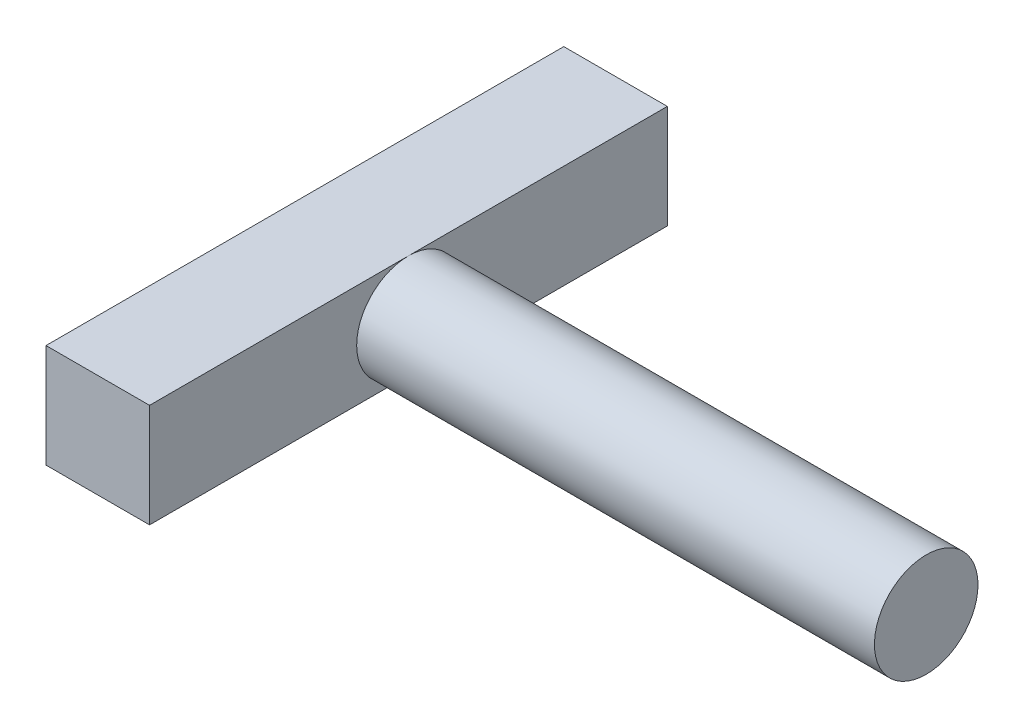
ISO-10303-21;
HEADER;
FILE_DESCRIPTION(('STEP AP214'),'2;1');
FILE_NAME('part.step','',(''),(''),'','','');
FILE_SCHEMA(('AUTOMOTIVE_DESIGN { 1 0 10303 214 1 1 1 1 }'));
ENDSEC;
DATA;
#1=APPLICATION_CONTEXT('core data for automotive mechanical design processes');
#2=APPLICATION_PROTOCOL_DEFINITION('international standard','automotive_design',2000,#1);
#3=PRODUCT_CONTEXT('',#1,'mechanical');
#4=PRODUCT('Part','Part','',(#3));
#5=PRODUCT_RELATED_PRODUCT_CATEGORY('part','',(#4));
#6=PRODUCT_DEFINITION_FORMATION('','',#4);
#7=PRODUCT_DEFINITION_CONTEXT('part definition',#1,'design');
#8=PRODUCT_DEFINITION('design','',#6,#7);
#9=PRODUCT_DEFINITION_SHAPE('','',#8);
#10=(LENGTH_UNIT() NAMED_UNIT(*) SI_UNIT(.MILLI.,.METRE.));
#11=(NAMED_UNIT(*) PLANE_ANGLE_UNIT() SI_UNIT($,.RADIAN.));
#12=(NAMED_UNIT(*) SI_UNIT($,.STERADIAN.) SOLID_ANGLE_UNIT());
#13=UNCERTAINTY_MEASURE_WITH_UNIT(LENGTH_MEASURE(1.E-05),#10,'distance_accuracy_value','');
#14=(GEOMETRIC_REPRESENTATION_CONTEXT(3) GLOBAL_UNCERTAINTY_ASSIGNED_CONTEXT((#13)) GLOBAL_UNIT_ASSIGNED_CONTEXT((#10,
#11,#12)) REPRESENTATION_CONTEXT('',''));
#15=CARTESIAN_POINT('',(0.,0.,0.));
#16=DIRECTION('',(0.,0.,1.));
#17=DIRECTION('',(1.,0.,0.));
#18=AXIS2_PLACEMENT_3D('',#15,#16,#17);
#19=CARTESIAN_POINT('',(12.7,12.7,127.));
#20=DIRECTION('',(-1.,0.,0.));
#21=DIRECTION('',(0.,0.,1.));
#22=AXIS2_PLACEMENT_3D('',#19,#20,#21);
#23=PLANE('',#22);
#24=CARTESIAN_POINT('',(12.7,0.,63.5));
#25=DIRECTION('',(1.,0.,0.));
#26=DIRECTION('',(0.,0.,-1.));
#27=AXIS2_PLACEMENT_3D('',#24,#25,#26);
#28=CIRCLE('',#27,12.7);
#29=CARTESIAN_POINT('',(12.7,12.7,63.5));
#30=VERTEX_POINT('',#29);
#31=CARTESIAN_POINT('',(12.7,-12.7,63.5));
#32=VERTEX_POINT('',#31);
#33=EDGE_CURVE('E56',#30,#32,#28,.T.);
#34=ORIENTED_EDGE('',*,*,#33,.F.);
#35=DIRECTION('',(0.,0.,-1.));
#36=VECTOR('',#35,1.);
#37=CARTESIAN_POINT('',(12.7,12.7,127.));
#38=LINE('',#37,#36);
#39=CARTESIAN_POINT('',(12.7,12.7,127.));
#40=VERTEX_POINT('',#39);
#41=EDGE_CURVE('E49',#40,#30,#38,.T.);
#42=ORIENTED_EDGE('',*,*,#41,.F.);
#43=DIRECTION('',(0.,1.,0.));
#44=VECTOR('',#43,1.);
#45=CARTESIAN_POINT('',(12.7,12.7,127.));
#46=LINE('',#45,#44);
#47=CARTESIAN_POINT('',(12.7,-12.7,127.));
#48=VERTEX_POINT('',#47);
#49=EDGE_CURVE('E153',#48,#40,#46,.T.);
#50=ORIENTED_EDGE('',*,*,#49,.F.);
#51=DIRECTION('',(0.,0.,-1.));
#52=VECTOR('',#51,1.);
#53=CARTESIAN_POINT('',(12.7,-12.7,127.));
#54=LINE('',#53,#52);
#55=EDGE_CURVE('E112',#48,#32,#54,.T.);
#56=ORIENTED_EDGE('',*,*,#55,.T.);
#57=EDGE_LOOP('',(#34,#42,#50,#56));
#58=FACE_BOUND('',#57,.T.);
#59=ADVANCED_FACE('F45',(#58),#23,.F.);
#60=EDGE_CURVE('E11',#32,#30,#28,.T.);
#61=ORIENTED_EDGE('',*,*,#60,.F.);
#62=CARTESIAN_POINT('',(12.7,-12.7,0.));
#63=VERTEX_POINT('',#62);
#64=EDGE_CURVE('E88',#32,#63,#54,.T.);
#65=ORIENTED_EDGE('',*,*,#64,.T.);
#66=DIRECTION('',(0.,1.,0.));
#67=VECTOR('',#66,1.);
#68=CARTESIAN_POINT('',(12.7,12.7,0.));
#69=LINE('',#68,#67);
#70=CARTESIAN_POINT('',(12.7,12.7,0.));
#71=VERTEX_POINT('',#70);
#72=EDGE_CURVE('E107',#63,#71,#69,.T.);
#73=ORIENTED_EDGE('',*,*,#72,.T.);
#74=EDGE_CURVE('E100',#30,#71,#38,.T.);
#75=ORIENTED_EDGE('',*,*,#74,.F.);
#76=EDGE_LOOP('',(#61,#65,#73,#75));
#77=FACE_BOUND('',#76,.T.);
#78=ADVANCED_FACE('F47',(#77),#23,.F.);
#79=CARTESIAN_POINT('',(-12.7,12.7,127.));
#80=DIRECTION('',(0.,-1.,0.));
#81=DIRECTION('',(0.,0.,-1.));
#82=AXIS2_PLACEMENT_3D('',#79,#80,#81);
#83=PLANE('',#82);
#84=DIRECTION('',(-1.,0.,0.));
#85=VECTOR('',#84,1.);
#86=CARTESIAN_POINT('',(-12.7,12.7,0.));
#87=LINE('',#86,#85);
#88=CARTESIAN_POINT('',(-12.7,12.7,0.));
#89=VERTEX_POINT('',#88);
#90=EDGE_CURVE('E171',#71,#89,#87,.T.);
#91=ORIENTED_EDGE('',*,*,#90,.T.);
#92=DIRECTION('',(0.,0.,-1.));
#93=VECTOR('',#92,1.);
#94=CARTESIAN_POINT('',(-12.7,12.7,127.));
#95=LINE('',#94,#93);
#96=CARTESIAN_POINT('',(-12.7,12.7,127.));
#97=VERTEX_POINT('',#96);
#98=EDGE_CURVE('E109',#97,#89,#95,.T.);
#99=ORIENTED_EDGE('',*,*,#98,.F.);
#100=DIRECTION('',(-1.,0.,0.));
#101=VECTOR('',#100,1.);
#102=CARTESIAN_POINT('',(-12.7,12.7,127.));
#103=LINE('',#102,#101);
#104=EDGE_CURVE('E96',#40,#97,#103,.T.);
#105=ORIENTED_EDGE('',*,*,#104,.F.);
#106=ORIENTED_EDGE('',*,*,#41,.T.);
#107=ORIENTED_EDGE('',*,*,#74,.T.);
#108=EDGE_LOOP('',(#91,#99,#105,#106,#107));
#109=FACE_BOUND('',#108,.T.);
#110=ADVANCED_FACE('F99',(#109),#83,.F.);
#111=CARTESIAN_POINT('',(-12.7,12.7,127.));
#112=DIRECTION('',(1.,0.,0.));
#113=DIRECTION('',(0.,0.,-1.));
#114=AXIS2_PLACEMENT_3D('',#111,#112,#113);
#115=PLANE('',#114);
#116=DIRECTION('',(0.,-1.,0.));
#117=VECTOR('',#116,1.);
#118=CARTESIAN_POINT('',(-12.7,12.7,0.));
#119=LINE('',#118,#117);
#120=CARTESIAN_POINT('',(-12.7,-12.7,0.));
#121=VERTEX_POINT('',#120);
#122=EDGE_CURVE('E161',#89,#121,#119,.T.);
#123=ORIENTED_EDGE('',*,*,#122,.T.);
#124=DIRECTION('',(0.,0.,-1.));
#125=VECTOR('',#124,1.);
#126=CARTESIAN_POINT('',(-12.7,-12.7,127.));
#127=LINE('',#126,#125);
#128=CARTESIAN_POINT('',(-12.7,-12.7,127.));
#129=VERTEX_POINT('',#128);
#130=EDGE_CURVE('E178',#129,#121,#127,.T.);
#131=ORIENTED_EDGE('',*,*,#130,.F.);
#132=DIRECTION('',(0.,-1.,0.));
#133=VECTOR('',#132,1.);
#134=CARTESIAN_POINT('',(-12.7,12.7,127.));
#135=LINE('',#134,#133);
#136=EDGE_CURVE('E159',#97,#129,#135,.T.);
#137=ORIENTED_EDGE('',*,*,#136,.F.);
#138=ORIENTED_EDGE('',*,*,#98,.T.);
#139=EDGE_LOOP('',(#123,#131,#137,#138));
#140=FACE_BOUND('',#139,.T.);
#141=ADVANCED_FACE('F141',(#140),#115,.F.);
#142=CARTESIAN_POINT('',(-12.7,-12.7,127.));
#143=DIRECTION('',(0.,1.,0.));
#144=DIRECTION('',(0.,0.,1.));
#145=AXIS2_PLACEMENT_3D('',#142,#143,#144);
#146=PLANE('',#145);
#147=DIRECTION('',(1.,0.,0.));
#148=VECTOR('',#147,1.);
#149=CARTESIAN_POINT('',(-12.7,-12.7,0.));
#150=LINE('',#149,#148);
#151=EDGE_CURVE('E155',#121,#63,#150,.T.);
#152=ORIENTED_EDGE('',*,*,#151,.T.);
#153=ORIENTED_EDGE('',*,*,#64,.F.);
#154=ORIENTED_EDGE('',*,*,#55,.F.);
#155=DIRECTION('',(1.,0.,0.));
#156=VECTOR('',#155,1.);
#157=CARTESIAN_POINT('',(-12.7,-12.7,127.));
#158=LINE('',#157,#156);
#159=EDGE_CURVE('E70',#129,#48,#158,.T.);
#160=ORIENTED_EDGE('',*,*,#159,.F.);
#161=ORIENTED_EDGE('',*,*,#130,.T.);
#162=EDGE_LOOP('',(#152,#153,#154,#160,#161));
#163=FACE_BOUND('',#162,.T.);
#164=ADVANCED_FACE('F145',(#163),#146,.F.);
#165=CARTESIAN_POINT('',(0.,0.,127.));
#166=DIRECTION('',(0.,0.,1.));
#167=DIRECTION('',(1.,0.,0.));
#168=AXIS2_PLACEMENT_3D('',#165,#166,#167);
#169=PLANE('',#168);
#170=ORIENTED_EDGE('',*,*,#49,.T.);
#171=ORIENTED_EDGE('',*,*,#104,.T.);
#172=ORIENTED_EDGE('',*,*,#136,.T.);
#173=ORIENTED_EDGE('',*,*,#159,.T.);
#174=EDGE_LOOP('',(#170,#171,#172,#173));
#175=FACE_BOUND('',#174,.T.);
#176=ADVANCED_FACE('F129',(#175),#169,.T.);
#177=CARTESIAN_POINT('',(0.,0.,0.));
#178=DIRECTION('',(0.,0.,1.));
#179=DIRECTION('',(1.,0.,0.));
#180=AXIS2_PLACEMENT_3D('',#177,#178,#179);
#181=PLANE('',#180);
#182=ORIENTED_EDGE('',*,*,#72,.F.);
#183=ORIENTED_EDGE('',*,*,#151,.F.);
#184=ORIENTED_EDGE('',*,*,#122,.F.);
#185=ORIENTED_EDGE('',*,*,#90,.F.);
#186=EDGE_LOOP('',(#182,#183,#184,#185));
#187=FACE_BOUND('',#186,.T.);
#188=ADVANCED_FACE('F119',(#187),#181,.F.);
#189=CARTESIAN_POINT('',(139.7,0.,63.5));
#190=DIRECTION('',(-1.,0.,0.));
#191=DIRECTION('',(0.,0.,1.));
#192=AXIS2_PLACEMENT_3D('',#189,#190,#191);
#193=CYLINDRICAL_SURFACE('',#192,12.7);
#194=CARTESIAN_POINT('',(139.7,0.,63.5));
#195=DIRECTION('',(1.,0.,0.));
#196=DIRECTION('',(0.,0.,-1.));
#197=AXIS2_PLACEMENT_3D('',#194,#195,#196);
#198=CIRCLE('',#197,12.7);
#199=CARTESIAN_POINT('',(139.7,0.,50.8));
#200=VERTEX_POINT('',#199);
#201=EDGE_CURVE('E115',#200,#200,#198,.T.);
#202=ORIENTED_EDGE('',*,*,#201,.F.);
#203=EDGE_LOOP('',(#202));
#204=FACE_BOUND('',#203,.T.);
#205=ORIENTED_EDGE('',*,*,#33,.T.);
#206=ORIENTED_EDGE('',*,*,#60,.T.);
#207=EDGE_LOOP('',(#205,#206));
#208=FACE_BOUND('',#207,.T.);
#209=ADVANCED_FACE('F116',(#204,#208),#193,.T.);
#210=CARTESIAN_POINT('',(139.7,0.,63.5));
#211=DIRECTION('',(1.,0.,0.));
#212=DIRECTION('',(0.,0.,-1.));
#213=AXIS2_PLACEMENT_3D('',#210,#211,#212);
#214=PLANE('',#213);
#215=ORIENTED_EDGE('',*,*,#201,.T.);
#216=EDGE_LOOP('',(#215));
#217=FACE_BOUND('',#216,.T.);
#218=ADVANCED_FACE('F118',(#217),#214,.T.);
#219=CLOSED_SHELL('',(#59,#78,#110,#141,#164,#176,#188,#209,#218));
#220=MANIFOLD_SOLID_BREP('B2',#219);
#221=ADVANCED_BREP_SHAPE_REPRESENTATION('',(#18,#220),#14);
#222=SHAPE_DEFINITION_REPRESENTATION(#9,#221);
ENDSEC;
END-ISO-10303-21;
